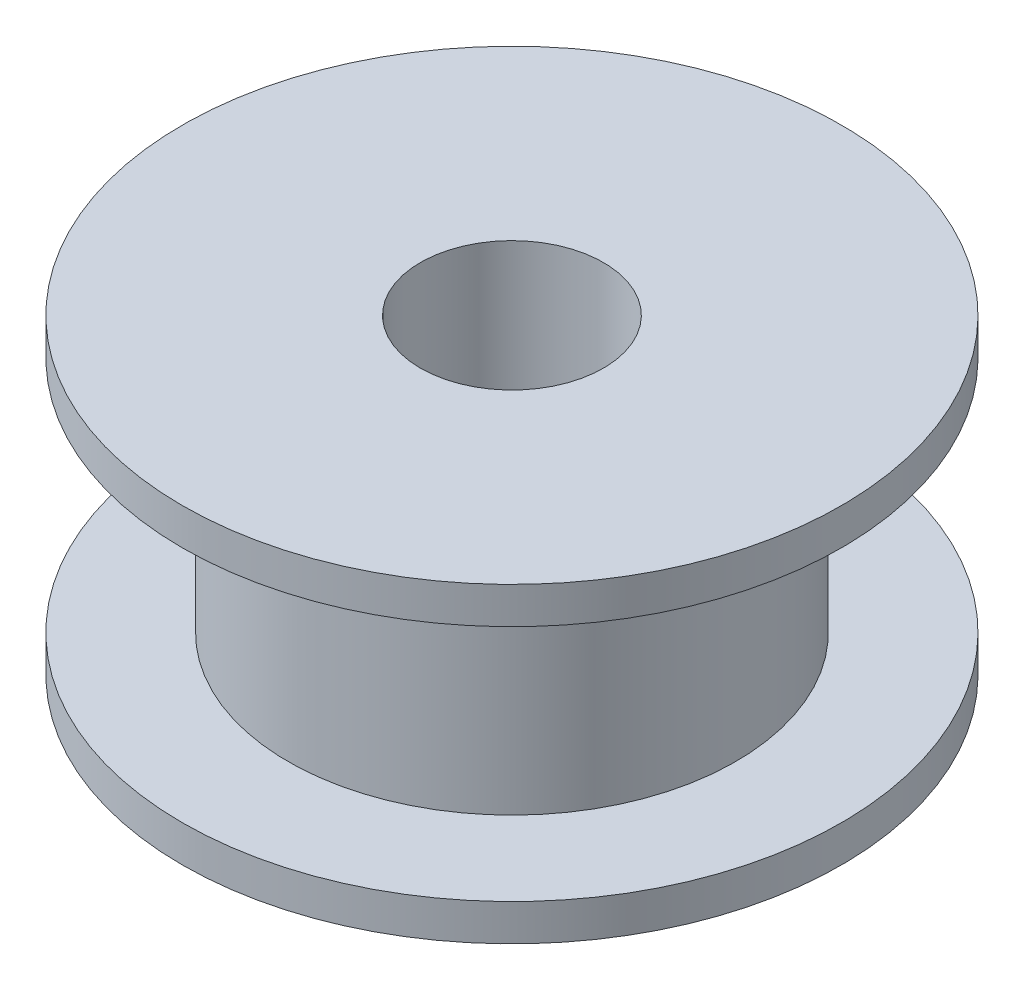
ISO-10303-21;
HEADER;
FILE_DESCRIPTION(('STEP AP214'),'2;1');
FILE_NAME('part.step','',(''),(''),'','','');
FILE_SCHEMA(('AUTOMOTIVE_DESIGN { 1 0 10303 214 1 1 1 1 }'));
ENDSEC;
DATA;
#1=APPLICATION_CONTEXT('core data for automotive mechanical design processes');
#2=APPLICATION_PROTOCOL_DEFINITION('international standard','automotive_design',2000,#1);
#3=PRODUCT_CONTEXT('',#1,'mechanical');
#4=PRODUCT('Part','Part','',(#3));
#5=PRODUCT_RELATED_PRODUCT_CATEGORY('part','',(#4));
#6=PRODUCT_DEFINITION_FORMATION('','',#4);
#7=PRODUCT_DEFINITION_CONTEXT('part definition',#1,'design');
#8=PRODUCT_DEFINITION('design','',#6,#7);
#9=PRODUCT_DEFINITION_SHAPE('','',#8);
#10=(LENGTH_UNIT() NAMED_UNIT(*) SI_UNIT(.MILLI.,.METRE.));
#11=(NAMED_UNIT(*) PLANE_ANGLE_UNIT() SI_UNIT($,.RADIAN.));
#12=(NAMED_UNIT(*) SI_UNIT($,.STERADIAN.) SOLID_ANGLE_UNIT());
#13=UNCERTAINTY_MEASURE_WITH_UNIT(LENGTH_MEASURE(1.E-05),#10,'distance_accuracy_value','');
#14=(GEOMETRIC_REPRESENTATION_CONTEXT(3) GLOBAL_UNCERTAINTY_ASSIGNED_CONTEXT((#13)) GLOBAL_UNIT_ASSIGNED_CONTEXT((#10,
#11,#12)) REPRESENTATION_CONTEXT('',''));
#15=CARTESIAN_POINT('',(0.,0.,0.));
#16=DIRECTION('',(0.,0.,1.));
#17=DIRECTION('',(1.,0.,0.));
#18=AXIS2_PLACEMENT_3D('',#15,#16,#17);
#19=CARTESIAN_POINT('',(0.,1.,0.));
#20=DIRECTION('',(0.,-1.,0.));
#21=DIRECTION('',(0.,0.,-1.));
#22=AXIS2_PLACEMENT_3D('',#19,#20,#21);
#23=CYLINDRICAL_SURFACE('',#22,9.);
#24=CARTESIAN_POINT('',(0.,1.,0.));
#25=DIRECTION('',(0.,1.,0.));
#26=DIRECTION('',(0.,0.,1.));
#27=AXIS2_PLACEMENT_3D('',#24,#25,#26);
#28=CIRCLE('',#27,9.);
#29=CARTESIAN_POINT('',(0.,1.,9.));
#30=VERTEX_POINT('',#29);
#31=EDGE_CURVE('E46',#30,#30,#28,.T.);
#32=ORIENTED_EDGE('',*,*,#31,.F.);
#33=EDGE_LOOP('',(#32));
#34=FACE_BOUND('',#33,.T.);
#35=CARTESIAN_POINT('',(0.,0.,0.));
#36=DIRECTION('',(0.,1.,0.));
#37=DIRECTION('',(0.,0.,1.));
#38=AXIS2_PLACEMENT_3D('',#35,#36,#37);
#39=CIRCLE('',#38,9.);
#40=CARTESIAN_POINT('',(0.,0.,9.));
#41=VERTEX_POINT('',#40);
#42=EDGE_CURVE('E42',#41,#41,#39,.T.);
#43=ORIENTED_EDGE('',*,*,#42,.T.);
#44=EDGE_LOOP('',(#43));
#45=FACE_BOUND('',#44,.T.);
#46=ADVANCED_FACE('F39',(#34,#45),#23,.T.);
#47=CARTESIAN_POINT('',(0.,1.,0.));
#48=DIRECTION('',(0.,1.,0.));
#49=DIRECTION('',(0.,0.,1.));
#50=AXIS2_PLACEMENT_3D('',#47,#48,#49);
#51=PLANE('',#50);
#52=CARTESIAN_POINT('',(0.,1.,0.));
#53=DIRECTION('',(0.,1.,0.));
#54=DIRECTION('',(0.,0.,1.));
#55=AXIS2_PLACEMENT_3D('',#52,#53,#54);
#56=CIRCLE('',#55,6.11);
#57=CARTESIAN_POINT('',(0.,1.,-6.11));
#58=VERTEX_POINT('',#57);
#59=EDGE_CURVE('E10',#58,#58,#56,.T.);
#60=ORIENTED_EDGE('',*,*,#59,.F.);
#61=EDGE_LOOP('',(#60));
#62=FACE_BOUND('',#61,.T.);
#63=ORIENTED_EDGE('',*,*,#31,.T.);
#64=EDGE_LOOP('',(#63));
#65=FACE_BOUND('',#64,.T.);
#66=ADVANCED_FACE('F94',(#62,#65),#51,.T.);
#67=CARTESIAN_POINT('',(0.,0.,0.));
#68=DIRECTION('',(0.,1.,0.));
#69=DIRECTION('',(0.,0.,1.));
#70=AXIS2_PLACEMENT_3D('',#67,#68,#69);
#71=PLANE('',#70);
#72=CARTESIAN_POINT('',(0.,0.,0.));
#73=DIRECTION('',(0.,1.,0.));
#74=DIRECTION('',(0.,0.,1.));
#75=AXIS2_PLACEMENT_3D('',#72,#73,#74);
#76=CIRCLE('',#75,2.5);
#77=CARTESIAN_POINT('',(0.,0.,2.5));
#78=VERTEX_POINT('',#77);
#79=EDGE_CURVE('E59',#78,#78,#76,.T.);
#80=ORIENTED_EDGE('',*,*,#79,.T.);
#81=EDGE_LOOP('',(#80));
#82=FACE_BOUND('',#81,.T.);
#83=ORIENTED_EDGE('',*,*,#42,.F.);
#84=EDGE_LOOP('',(#83));
#85=FACE_BOUND('',#84,.T.);
#86=ADVANCED_FACE('F99',(#82,#85),#71,.F.);
#87=CARTESIAN_POINT('',(0.,7.5,0.));
#88=DIRECTION('',(0.,-1.,0.));
#89=DIRECTION('',(0.,0.,-1.));
#90=AXIS2_PLACEMENT_3D('',#87,#88,#89);
#91=CYLINDRICAL_SURFACE('',#90,6.11);
#92=CARTESIAN_POINT('',(0.,7.5,0.));
#93=DIRECTION('',(0.,1.,0.));
#94=DIRECTION('',(0.,0.,1.));
#95=AXIS2_PLACEMENT_3D('',#92,#93,#94);
#96=CIRCLE('',#95,6.11);
#97=CARTESIAN_POINT('',(0.,7.5,-6.11));
#98=VERTEX_POINT('',#97);
#99=EDGE_CURVE('E52',#98,#98,#96,.T.);
#100=CARTESIAN_POINT('',(0.,7.5,-6.11));
#101=CARTESIAN_POINT('',(0.,7.43229166666667,-6.11));
#102=CARTESIAN_POINT('',(0.,7.36458333333333,-6.11));
#103=CARTESIAN_POINT('',(0.,7.22916666666667,-6.11));
#104=CARTESIAN_POINT('',(0.,7.16145833333333,-6.11));
#105=CARTESIAN_POINT('',(0.,7.02604166666667,-6.11));
#106=CARTESIAN_POINT('',(0.,6.95833333333333,-6.11));
#107=CARTESIAN_POINT('',(0.,6.82291666666667,-6.11));
#108=CARTESIAN_POINT('',(0.,6.75520833333333,-6.11));
#109=CARTESIAN_POINT('',(0.,6.61979166666667,-6.11));
#110=CARTESIAN_POINT('',(0.,6.55208333333333,-6.11));
#111=CARTESIAN_POINT('',(0.,6.41666666666667,-6.11));
#112=CARTESIAN_POINT('',(0.,6.34895833333333,-6.11));
#113=CARTESIAN_POINT('',(0.,6.21354166666667,-6.11));
#114=CARTESIAN_POINT('',(0.,6.14583333333333,-6.11));
#115=CARTESIAN_POINT('',(0.,6.01041666666667,-6.11));
#116=CARTESIAN_POINT('',(0.,5.94270833333333,-6.11));
#117=CARTESIAN_POINT('',(0.,5.80729166666667,-6.11));
#118=CARTESIAN_POINT('',(0.,5.73958333333333,-6.11));
#119=CARTESIAN_POINT('',(0.,5.60416666666667,-6.11));
#120=CARTESIAN_POINT('',(0.,5.53645833333333,-6.11));
#121=CARTESIAN_POINT('',(0.,5.40104166666667,-6.11));
#122=CARTESIAN_POINT('',(0.,5.33333333333333,-6.11));
#123=CARTESIAN_POINT('',(0.,5.19791666666667,-6.11));
#124=CARTESIAN_POINT('',(0.,5.13020833333333,-6.11));
#125=CARTESIAN_POINT('',(0.,4.99479166666667,-6.11));
#126=CARTESIAN_POINT('',(0.,4.92708333333333,-6.11));
#127=CARTESIAN_POINT('',(0.,4.79166666666667,-6.11));
#128=CARTESIAN_POINT('',(0.,4.72395833333333,-6.11));
#129=CARTESIAN_POINT('',(0.,4.58854166666667,-6.11));
#130=CARTESIAN_POINT('',(0.,4.52083333333333,-6.11));
#131=CARTESIAN_POINT('',(0.,4.38541666666667,-6.11));
#132=CARTESIAN_POINT('',(0.,4.31770833333333,-6.11));
#133=CARTESIAN_POINT('',(0.,4.18229166666667,-6.11));
#134=CARTESIAN_POINT('',(0.,4.11458333333333,-6.11));
#135=CARTESIAN_POINT('',(0.,3.97916666666667,-6.11));
#136=CARTESIAN_POINT('',(0.,3.91145833333333,-6.11));
#137=CARTESIAN_POINT('',(0.,3.77604166666667,-6.11));
#138=CARTESIAN_POINT('',(0.,3.70833333333333,-6.11));
#139=CARTESIAN_POINT('',(0.,3.57291666666667,-6.11));
#140=CARTESIAN_POINT('',(0.,3.50520833333333,-6.11));
#141=CARTESIAN_POINT('',(0.,3.36979166666667,-6.11));
#142=CARTESIAN_POINT('',(0.,3.30208333333333,-6.11));
#143=CARTESIAN_POINT('',(0.,3.16666666666667,-6.11));
#144=CARTESIAN_POINT('',(0.,3.09895833333333,-6.11));
#145=CARTESIAN_POINT('',(0.,2.96354166666667,-6.11));
#146=CARTESIAN_POINT('',(0.,2.89583333333333,-6.11));
#147=CARTESIAN_POINT('',(0.,2.76041666666667,-6.11));
#148=CARTESIAN_POINT('',(0.,2.69270833333333,-6.11));
#149=CARTESIAN_POINT('',(0.,2.55729166666667,-6.11));
#150=CARTESIAN_POINT('',(0.,2.48958333333333,-6.11));
#151=CARTESIAN_POINT('',(0.,2.35416666666667,-6.11));
#152=CARTESIAN_POINT('',(0.,2.28645833333333,-6.11));
#153=CARTESIAN_POINT('',(0.,2.15104166666667,-6.11));
#154=CARTESIAN_POINT('',(0.,2.08333333333333,-6.11));
#155=CARTESIAN_POINT('',(0.,1.94791666666667,-6.11));
#156=CARTESIAN_POINT('',(0.,1.88020833333333,-6.11));
#157=CARTESIAN_POINT('',(0.,1.74479166666667,-6.11));
#158=CARTESIAN_POINT('',(0.,1.67708333333333,-6.11));
#159=CARTESIAN_POINT('',(0.,1.54166666666667,-6.11));
#160=CARTESIAN_POINT('',(0.,1.47395833333333,-6.11));
#161=CARTESIAN_POINT('',(0.,1.33854166666667,-6.11));
#162=CARTESIAN_POINT('',(0.,1.27083333333333,-6.11));
#163=CARTESIAN_POINT('',(0.,1.13541666666667,-6.11));
#164=CARTESIAN_POINT('',(0.,1.06770833333333,-6.11));
#165=CARTESIAN_POINT('',(0.,1.,-6.11));
#166=B_SPLINE_CURVE_WITH_KNOTS('',3,(#100,#101,#102,#103,#104,#105,#106,#107,#108,#109,#110,
#111,#112,#113,#114,#115,#116,#117,#118,#119,#120,#121,#122,#123,#124,#125,#126,#127,#128,#129,
#130,#131,#132,#133,#134,#135,#136,#137,#138,#139,#140,#141,#142,#143,#144,#145,#146,#147,#148,
#149,#150,#151,#152,#153,#154,#155,#156,#157,#158,#159,#160,#161,#162,#163,#164,#165),
.UNSPECIFIED.,.F.,.F.,(4,2,2,2,2,2,2,2,2,2,2,2,2,2,2,2,2,2,2,2,2,2,2,2,2,2,2,2,2,2,2,2,4),(0.,
0.203125,0.40625,0.609375000000001,0.812500000000001,1.015625,1.21875,1.421875,1.625,1.828125,
2.03125,2.234375,2.4375,2.640625,2.84375,3.046875,3.25,3.453125,3.65625,3.859375,4.0625,
4.265625,4.46875,4.671875,4.875,5.078125,5.28125,5.484375,5.6875,5.890625,6.09375,6.296875,6.5),.UNSPECIFIED.);
#167=EDGE_CURVE('BSEAM81',#98,#58,#166,.T.);
#168=ORIENTED_EDGE('',*,*,#99,.F.);
#169=ORIENTED_EDGE('',*,*,#59,.T.);
#170=ORIENTED_EDGE('',*,*,#167,.T.);
#171=ORIENTED_EDGE('',*,*,#167,.F.);
#172=EDGE_LOOP('',(#168,#170,#169,#171));
#173=FACE_BOUND('',#172,.T.);
#174=ADVANCED_FACE('F81',(#173),#91,.T.);
#175=CARTESIAN_POINT('',(0.,8.5,0.));
#176=DIRECTION('',(0.,-1.,0.));
#177=DIRECTION('',(0.,0.,-1.));
#178=AXIS2_PLACEMENT_3D('',#175,#176,#177);
#179=CYLINDRICAL_SURFACE('',#178,9.);
#180=CARTESIAN_POINT('',(0.,8.5,0.));
#181=DIRECTION('',(0.,1.,0.));
#182=DIRECTION('',(0.,0.,1.));
#183=AXIS2_PLACEMENT_3D('',#180,#181,#182);
#184=CIRCLE('',#183,9.);
#185=CARTESIAN_POINT('',(0.,8.5,9.));
#186=VERTEX_POINT('',#185);
#187=EDGE_CURVE('E55',#186,#186,#184,.T.);
#188=ORIENTED_EDGE('',*,*,#187,.F.);
#189=EDGE_LOOP('',(#188));
#190=FACE_BOUND('',#189,.T.);
#191=CARTESIAN_POINT('',(0.,7.5,0.));
#192=DIRECTION('',(0.,1.,0.));
#193=DIRECTION('',(0.,0.,1.));
#194=AXIS2_PLACEMENT_3D('',#191,#192,#193);
#195=CIRCLE('',#194,9.);
#196=CARTESIAN_POINT('',(0.,7.5,9.));
#197=VERTEX_POINT('',#196);
#198=EDGE_CURVE('E56',#197,#197,#195,.T.);
#199=ORIENTED_EDGE('',*,*,#198,.T.);
#200=EDGE_LOOP('',(#199));
#201=FACE_BOUND('',#200,.T.);
#202=ADVANCED_FACE('F75',(#190,#201),#179,.T.);
#203=CARTESIAN_POINT('',(0.,8.5,0.));
#204=DIRECTION('',(0.,1.,0.));
#205=DIRECTION('',(0.,0.,1.));
#206=AXIS2_PLACEMENT_3D('',#203,#204,#205);
#207=PLANE('',#206);
#208=CARTESIAN_POINT('',(0.,8.5,0.));
#209=DIRECTION('',(0.,1.,0.));
#210=DIRECTION('',(0.,0.,1.));
#211=AXIS2_PLACEMENT_3D('',#208,#209,#210);
#212=CIRCLE('',#211,2.5);
#213=CARTESIAN_POINT('',(0.,8.5,2.5));
#214=VERTEX_POINT('',#213);
#215=EDGE_CURVE('E64',#214,#214,#212,.T.);
#216=ORIENTED_EDGE('',*,*,#215,.F.);
#217=EDGE_LOOP('',(#216));
#218=FACE_BOUND('',#217,.T.);
#219=ORIENTED_EDGE('',*,*,#187,.T.);
#220=EDGE_LOOP('',(#219));
#221=FACE_BOUND('',#220,.T.);
#222=ADVANCED_FACE('F71',(#218,#221),#207,.T.);
#223=CARTESIAN_POINT('',(0.,7.5,0.));
#224=DIRECTION('',(0.,1.,0.));
#225=DIRECTION('',(0.,0.,1.));
#226=AXIS2_PLACEMENT_3D('',#223,#224,#225);
#227=PLANE('',#226);
#228=ORIENTED_EDGE('',*,*,#99,.T.);
#229=EDGE_LOOP('',(#228));
#230=FACE_BOUND('',#229,.T.);
#231=ORIENTED_EDGE('',*,*,#198,.F.);
#232=EDGE_LOOP('',(#231));
#233=FACE_BOUND('',#232,.T.);
#234=ADVANCED_FACE('F74',(#230,#233),#227,.F.);
#235=CARTESIAN_POINT('',(0.,-4.5,0.));
#236=DIRECTION('',(0.,1.,0.));
#237=DIRECTION('',(0.,0.,1.));
#238=AXIS2_PLACEMENT_3D('',#235,#236,#237);
#239=CYLINDRICAL_SURFACE('',#238,2.5);
#240=CARTESIAN_POINT('',(0.,8.5,2.5));
#241=CARTESIAN_POINT('',(0.,8.41145833333333,2.5));
#242=CARTESIAN_POINT('',(0.,8.32291666666667,2.5));
#243=CARTESIAN_POINT('',(0.,8.14583333333333,2.5));
#244=CARTESIAN_POINT('',(0.,8.05729166666667,2.5));
#245=CARTESIAN_POINT('',(0.,7.88020833333333,2.5));
#246=CARTESIAN_POINT('',(0.,7.79166666666666,2.5));
#247=CARTESIAN_POINT('',(0.,7.61458333333333,2.5));
#248=CARTESIAN_POINT('',(0.,7.52604166666666,2.5));
#249=CARTESIAN_POINT('',(0.,7.34895833333333,2.5));
#250=CARTESIAN_POINT('',(0.,7.26041666666667,2.5));
#251=CARTESIAN_POINT('',(0.,7.08333333333333,2.5));
#252=CARTESIAN_POINT('',(0.,6.99479166666667,2.5));
#253=CARTESIAN_POINT('',(0.,6.81770833333333,2.5));
#254=CARTESIAN_POINT('',(0.,6.72916666666667,2.5));
#255=CARTESIAN_POINT('',(0.,6.55208333333333,2.5));
#256=CARTESIAN_POINT('',(0.,6.46354166666667,2.5));
#257=CARTESIAN_POINT('',(0.,6.28645833333333,2.5));
#258=CARTESIAN_POINT('',(0.,6.19791666666667,2.5));
#259=CARTESIAN_POINT('',(0.,6.02083333333333,2.5));
#260=CARTESIAN_POINT('',(0.,5.93229166666666,2.5));
#261=CARTESIAN_POINT('',(0.,5.75520833333333,2.5));
#262=CARTESIAN_POINT('',(0.,5.66666666666666,2.5));
#263=CARTESIAN_POINT('',(0.,5.48958333333333,2.5));
#264=CARTESIAN_POINT('',(0.,5.40104166666667,2.5));
#265=CARTESIAN_POINT('',(0.,5.22395833333333,2.5));
#266=CARTESIAN_POINT('',(0.,5.13541666666667,2.5));
#267=CARTESIAN_POINT('',(0.,4.95833333333333,2.5));
#268=CARTESIAN_POINT('',(0.,4.86979166666667,2.5));
#269=CARTESIAN_POINT('',(0.,4.69270833333333,2.5));
#270=CARTESIAN_POINT('',(0.,4.60416666666667,2.5));
#271=CARTESIAN_POINT('',(0.,4.42708333333333,2.5));
#272=CARTESIAN_POINT('',(0.,4.33854166666667,2.5));
#273=CARTESIAN_POINT('',(0.,4.16145833333333,2.5));
#274=CARTESIAN_POINT('',(0.,4.07291666666667,2.5));
#275=CARTESIAN_POINT('',(0.,3.89583333333333,2.5));
#276=CARTESIAN_POINT('',(0.,3.80729166666667,2.5));
#277=CARTESIAN_POINT('',(0.,3.63020833333333,2.5));
#278=CARTESIAN_POINT('',(0.,3.54166666666667,2.5));
#279=CARTESIAN_POINT('',(0.,3.36458333333333,2.5));
#280=CARTESIAN_POINT('',(0.,3.27604166666667,2.5));
#281=CARTESIAN_POINT('',(0.,3.09895833333333,2.5));
#282=CARTESIAN_POINT('',(0.,3.01041666666667,2.5));
#283=CARTESIAN_POINT('',(0.,2.83333333333333,2.5));
#284=CARTESIAN_POINT('',(0.,2.74479166666667,2.5));
#285=CARTESIAN_POINT('',(0.,2.56770833333333,2.5));
#286=CARTESIAN_POINT('',(0.,2.47916666666667,2.5));
#287=CARTESIAN_POINT('',(0.,2.30208333333333,2.5));
#288=CARTESIAN_POINT('',(0.,2.21354166666667,2.5));
#289=CARTESIAN_POINT('',(0.,2.03645833333333,2.5));
#290=CARTESIAN_POINT('',(0.,1.94791666666667,2.5));
#291=CARTESIAN_POINT('',(0.,1.77083333333333,2.5));
#292=CARTESIAN_POINT('',(0.,1.68229166666667,2.5));
#293=CARTESIAN_POINT('',(0.,1.50520833333333,2.5));
#294=CARTESIAN_POINT('',(0.,1.41666666666667,2.5));
#295=CARTESIAN_POINT('',(0.,1.23958333333333,2.5));
#296=CARTESIAN_POINT('',(0.,1.15104166666667,2.5));
#297=CARTESIAN_POINT('',(0.,0.973958333333332,2.5));
#298=CARTESIAN_POINT('',(0.,0.885416666666666,2.5));
#299=CARTESIAN_POINT('',(0.,0.708333333333332,2.5));
#300=CARTESIAN_POINT('',(0.,0.619791666666666,2.5));
#301=CARTESIAN_POINT('',(0.,0.442708333333333,2.5));
#302=CARTESIAN_POINT('',(0.,0.354166666666666,2.5));
#303=CARTESIAN_POINT('',(0.,0.177083333333333,2.5));
#304=CARTESIAN_POINT('',(0.,0.0885416666666657,2.5));
#305=CARTESIAN_POINT('',(0.,0.,2.5));
#306=B_SPLINE_CURVE_WITH_KNOTS('',3,(#240,#241,#242,#243,#244,#245,#246,#247,#248,#249,#250,
#251,#252,#253,#254,#255,#256,#257,#258,#259,#260,#261,#262,#263,#264,#265,#266,#267,#268,#269,
#270,#271,#272,#273,#274,#275,#276,#277,#278,#279,#280,#281,#282,#283,#284,#285,#286,#287,#288,
#289,#290,#291,#292,#293,#294,#295,#296,#297,#298,#299,#300,#301,#302,#303,#304,#305),
.UNSPECIFIED.,.F.,.F.,(4,2,2,2,2,2,2,2,2,2,2,2,2,2,2,2,2,2,2,2,2,2,2,2,2,2,2,2,2,2,2,2,4),(0.,
0.265625,0.53125,0.796875000000001,1.0625,1.328125,1.59375,1.859375,2.125,2.390625,2.65625,
2.921875,3.1875,3.453125,3.71875,3.984375,4.25,4.515625,4.78125,5.046875,5.3125,5.578125,
5.84375,6.109375,6.375,6.640625,6.90625,7.171875,7.4375,7.703125,7.96875,8.234375,8.5),.UNSPECIFIED.);
#307=EDGE_CURVE('BSEAM68',#214,#78,#306,.T.);
#308=ORIENTED_EDGE('',*,*,#215,.T.);
#309=ORIENTED_EDGE('',*,*,#79,.F.);
#310=ORIENTED_EDGE('',*,*,#307,.T.);
#311=ORIENTED_EDGE('',*,*,#307,.F.);
#312=EDGE_LOOP('',(#308,#310,#309,#311));
#313=FACE_BOUND('',#312,.T.);
#314=ADVANCED_FACE('F68',(#313),#239,.F.);
#315=CLOSED_SHELL('',(#46,#66,#86,#174,#202,#222,#234,#314));
#316=MANIFOLD_SOLID_BREP('B2',#315);
#317=ADVANCED_BREP_SHAPE_REPRESENTATION('',(#18,#316),#14);
#318=SHAPE_DEFINITION_REPRESENTATION(#9,#317);
ENDSEC;
END-ISO-10303-21;
